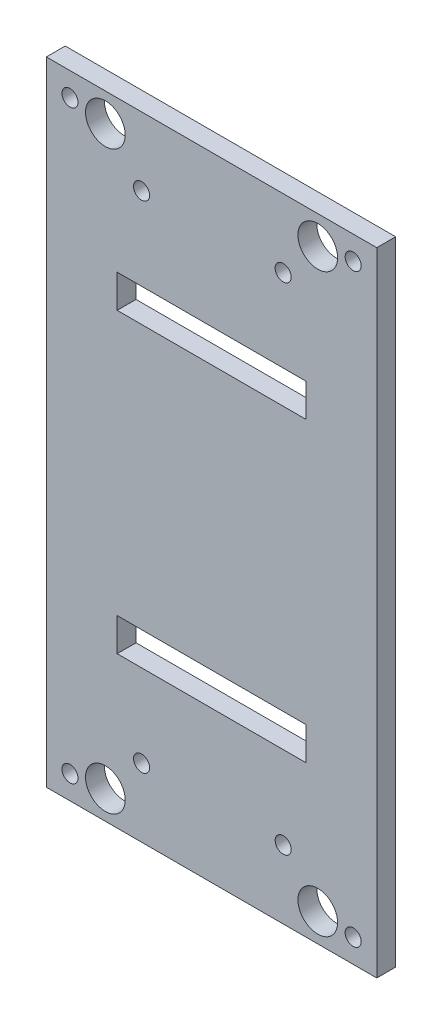
ISO-10303-21;
HEADER;
FILE_DESCRIPTION(('STEP AP214'),'2;1');
FILE_NAME('part.step','',(''),(''),'','','');
FILE_SCHEMA(('AUTOMOTIVE_DESIGN { 1 0 10303 214 1 1 1 1 }'));
ENDSEC;
DATA;
#1=APPLICATION_CONTEXT('core data for automotive mechanical design processes');
#2=APPLICATION_PROTOCOL_DEFINITION('international standard','automotive_design',2000,#1);
#3=PRODUCT_CONTEXT('',#1,'mechanical');
#4=PRODUCT('Part','Part','',(#3));
#5=PRODUCT_RELATED_PRODUCT_CATEGORY('part','',(#4));
#6=PRODUCT_DEFINITION_FORMATION('','',#4);
#7=PRODUCT_DEFINITION_CONTEXT('part definition',#1,'design');
#8=PRODUCT_DEFINITION('design','',#6,#7);
#9=PRODUCT_DEFINITION_SHAPE('','',#8);
#10=(LENGTH_UNIT() NAMED_UNIT(*) SI_UNIT(.MILLI.,.METRE.));
#11=(NAMED_UNIT(*) PLANE_ANGLE_UNIT() SI_UNIT($,.RADIAN.));
#12=(NAMED_UNIT(*) SI_UNIT($,.STERADIAN.) SOLID_ANGLE_UNIT());
#13=UNCERTAINTY_MEASURE_WITH_UNIT(LENGTH_MEASURE(1.E-05),#10,'distance_accuracy_value','');
#14=(GEOMETRIC_REPRESENTATION_CONTEXT(3) GLOBAL_UNCERTAINTY_ASSIGNED_CONTEXT((#13)) GLOBAL_UNIT_ASSIGNED_CONTEXT((#10,
#11,#12)) REPRESENTATION_CONTEXT('',''));
#15=CARTESIAN_POINT('',(0.,0.,0.));
#16=DIRECTION('',(0.,0.,1.));
#17=DIRECTION('',(1.,0.,0.));
#18=AXIS2_PLACEMENT_3D('',#15,#16,#17);
#19=CARTESIAN_POINT('',(-35.,-67.,61.));
#20=DIRECTION('',(1.,0.,0.));
#21=DIRECTION('',(0.,0.,-1.));
#22=AXIS2_PLACEMENT_3D('',#19,#20,#21);
#23=PLANE('',#22);
#24=DIRECTION('',(0.,-1.,0.));
#25=VECTOR('',#24,1.);
#26=CARTESIAN_POINT('',(-35.,-67.,57.));
#27=LINE('',#26,#25);
#28=CARTESIAN_POINT('',(-35.,67.,57.));
#29=VERTEX_POINT('',#28);
#30=CARTESIAN_POINT('',(-35.,-67.,57.));
#31=VERTEX_POINT('',#30);
#32=EDGE_CURVE('E268',#29,#31,#27,.T.);
#33=ORIENTED_EDGE('',*,*,#32,.T.);
#34=DIRECTION('',(0.,0.,-1.));
#35=VECTOR('',#34,1.);
#36=CARTESIAN_POINT('',(-35.,-67.,61.));
#37=LINE('',#36,#35);
#38=CARTESIAN_POINT('',(-35.,-67.,61.));
#39=VERTEX_POINT('',#38);
#40=EDGE_CURVE('E137',#39,#31,#37,.T.);
#41=ORIENTED_EDGE('',*,*,#40,.F.);
#42=DIRECTION('',(0.,-1.,0.));
#43=VECTOR('',#42,1.);
#44=CARTESIAN_POINT('',(-35.,-67.,61.));
#45=LINE('',#44,#43);
#46=CARTESIAN_POINT('',(-35.,67.,61.));
#47=VERTEX_POINT('',#46);
#48=EDGE_CURVE('E269',#47,#39,#45,.T.);
#49=ORIENTED_EDGE('',*,*,#48,.F.);
#50=DIRECTION('',(0.,0.,-1.));
#51=VECTOR('',#50,1.);
#52=CARTESIAN_POINT('',(-35.,67.,61.));
#53=LINE('',#52,#51);
#54=EDGE_CURVE('E279',#47,#29,#53,.T.);
#55=ORIENTED_EDGE('',*,*,#54,.T.);
#56=EDGE_LOOP('',(#33,#41,#49,#55));
#57=FACE_BOUND('',#56,.T.);
#58=ADVANCED_FACE('F41',(#57),#23,.F.);
#59=CARTESIAN_POINT('',(-35.,-67.,61.));
#60=DIRECTION('',(0.,1.,0.));
#61=DIRECTION('',(0.,0.,1.));
#62=AXIS2_PLACEMENT_3D('',#59,#60,#61);
#63=PLANE('',#62);
#64=DIRECTION('',(1.,0.,0.));
#65=VECTOR('',#64,1.);
#66=CARTESIAN_POINT('',(-35.,-67.,57.));
#67=LINE('',#66,#65);
#68=CARTESIAN_POINT('',(35.,-67.,57.));
#69=VERTEX_POINT('',#68);
#70=EDGE_CURVE('E282',#31,#69,#67,.T.);
#71=ORIENTED_EDGE('',*,*,#70,.T.);
#72=DIRECTION('',(0.,0.,-1.));
#73=VECTOR('',#72,1.);
#74=CARTESIAN_POINT('',(35.,-67.,61.));
#75=LINE('',#74,#73);
#76=CARTESIAN_POINT('',(35.,-67.,61.));
#77=VERTEX_POINT('',#76);
#78=EDGE_CURVE('E292',#77,#69,#75,.T.);
#79=ORIENTED_EDGE('',*,*,#78,.F.);
#80=DIRECTION('',(1.,0.,0.));
#81=VECTOR('',#80,1.);
#82=CARTESIAN_POINT('',(-35.,-67.,61.));
#83=LINE('',#82,#81);
#84=EDGE_CURVE('E272',#39,#77,#83,.T.);
#85=ORIENTED_EDGE('',*,*,#84,.F.);
#86=ORIENTED_EDGE('',*,*,#40,.T.);
#87=EDGE_LOOP('',(#71,#79,#85,#86));
#88=FACE_BOUND('',#87,.T.);
#89=ADVANCED_FACE('F320',(#88),#63,.F.);
#90=CARTESIAN_POINT('',(35.,-67.,61.));
#91=DIRECTION('',(-1.,0.,0.));
#92=DIRECTION('',(0.,0.,1.));
#93=AXIS2_PLACEMENT_3D('',#90,#91,#92);
#94=PLANE('',#93);
#95=DIRECTION('',(0.,1.,0.));
#96=VECTOR('',#95,1.);
#97=CARTESIAN_POINT('',(35.,-67.,57.));
#98=LINE('',#97,#96);
#99=CARTESIAN_POINT('',(35.,67.,57.));
#100=VERTEX_POINT('',#99);
#101=EDGE_CURVE('E284',#69,#100,#98,.T.);
#102=ORIENTED_EDGE('',*,*,#101,.T.);
#103=DIRECTION('',(0.,0.,-1.));
#104=VECTOR('',#103,1.);
#105=CARTESIAN_POINT('',(35.,67.,61.));
#106=LINE('',#105,#104);
#107=CARTESIAN_POINT('',(35.,67.,61.));
#108=VERTEX_POINT('',#107);
#109=EDGE_CURVE('E289',#108,#100,#106,.T.);
#110=ORIENTED_EDGE('',*,*,#109,.F.);
#111=DIRECTION('',(0.,1.,0.));
#112=VECTOR('',#111,1.);
#113=CARTESIAN_POINT('',(35.,-67.,61.));
#114=LINE('',#113,#112);
#115=EDGE_CURVE('E275',#77,#108,#114,.T.);
#116=ORIENTED_EDGE('',*,*,#115,.F.);
#117=ORIENTED_EDGE('',*,*,#78,.T.);
#118=EDGE_LOOP('',(#102,#110,#116,#117));
#119=FACE_BOUND('',#118,.T.);
#120=ADVANCED_FACE('F325',(#119),#94,.F.);
#121=CARTESIAN_POINT('',(-35.,67.,61.));
#122=DIRECTION('',(0.,-1.,0.));
#123=DIRECTION('',(0.,0.,-1.));
#124=AXIS2_PLACEMENT_3D('',#121,#122,#123);
#125=PLANE('',#124);
#126=DIRECTION('',(-1.,0.,0.));
#127=VECTOR('',#126,1.);
#128=CARTESIAN_POINT('',(-35.,67.,57.));
#129=LINE('',#128,#127);
#130=EDGE_CURVE('E273',#100,#29,#129,.T.);
#131=ORIENTED_EDGE('',*,*,#130,.T.);
#132=ORIENTED_EDGE('',*,*,#54,.F.);
#133=DIRECTION('',(-1.,0.,0.));
#134=VECTOR('',#133,1.);
#135=CARTESIAN_POINT('',(-35.,67.,61.));
#136=LINE('',#135,#134);
#137=EDGE_CURVE('E277',#108,#47,#136,.T.);
#138=ORIENTED_EDGE('',*,*,#137,.F.);
#139=ORIENTED_EDGE('',*,*,#109,.T.);
#140=EDGE_LOOP('',(#131,#132,#138,#139));
#141=FACE_BOUND('',#140,.T.);
#142=ADVANCED_FACE('F307',(#141),#125,.F.);
#143=CARTESIAN_POINT('',(0.,0.,61.));
#144=DIRECTION('',(0.,0.,-1.));
#145=DIRECTION('',(-1.,0.,0.));
#146=AXIS2_PLACEMENT_3D('',#143,#144,#145);
#147=PLANE('',#146);
#148=CARTESIAN_POINT('',(-22.5,61.,61.));
#149=DIRECTION('',(0.,0.,-1.));
#150=DIRECTION('',(-1.,0.,0.));
#151=AXIS2_PLACEMENT_3D('',#148,#149,#150);
#152=CIRCLE('',#151,4.2);
#153=CARTESIAN_POINT('',(-26.7,61.,61.));
#154=VERTEX_POINT('',#153);
#155=EDGE_CURVE('E212',#154,#154,#152,.T.);
#156=ORIENTED_EDGE('',*,*,#155,.T.);
#157=EDGE_LOOP('',(#156));
#158=FACE_BOUND('',#157,.T.);
#159=CARTESIAN_POINT('',(22.5,-61.,61.));
#160=DIRECTION('',(0.,0.,-1.));
#161=DIRECTION('',(-1.,0.,0.));
#162=AXIS2_PLACEMENT_3D('',#159,#160,#161);
#163=CIRCLE('',#162,4.2);
#164=CARTESIAN_POINT('',(18.3,-61.,61.));
#165=VERTEX_POINT('',#164);
#166=EDGE_CURVE('E201',#165,#165,#163,.T.);
#167=ORIENTED_EDGE('',*,*,#166,.T.);
#168=EDGE_LOOP('',(#167));
#169=FACE_BOUND('',#168,.T.);
#170=CARTESIAN_POINT('',(22.5,61.,61.));
#171=DIRECTION('',(0.,0.,-1.));
#172=DIRECTION('',(-1.,0.,0.));
#173=AXIS2_PLACEMENT_3D('',#170,#171,#172);
#174=CIRCLE('',#173,4.2);
#175=CARTESIAN_POINT('',(18.3,61.,61.));
#176=VERTEX_POINT('',#175);
#177=EDGE_CURVE('E198',#176,#176,#174,.T.);
#178=ORIENTED_EDGE('',*,*,#177,.T.);
#179=EDGE_LOOP('',(#178));
#180=FACE_BOUND('',#179,.T.);
#181=CARTESIAN_POINT('',(-22.5,-61.,61.));
#182=DIRECTION('',(0.,0.,-1.));
#183=DIRECTION('',(-1.,0.,0.));
#184=AXIS2_PLACEMENT_3D('',#181,#182,#183);
#185=CIRCLE('',#184,4.2);
#186=CARTESIAN_POINT('',(-26.7,-61.,61.));
#187=VERTEX_POINT('',#186);
#188=EDGE_CURVE('E195',#187,#187,#185,.T.);
#189=ORIENTED_EDGE('',*,*,#188,.T.);
#190=EDGE_LOOP('',(#189));
#191=FACE_BOUND('',#190,.T.);
#192=CARTESIAN_POINT('',(15.1722816789,52.5,61.));
#193=DIRECTION('',(0.,0.,-1.));
#194=DIRECTION('',(-1.,0.,0.));
#195=AXIS2_PLACEMENT_3D('',#192,#193,#194);
#196=CIRCLE('',#195,1.7);
#197=CARTESIAN_POINT('',(13.4722816789,52.5,61.));
#198=VERTEX_POINT('',#197);
#199=EDGE_CURVE('E191',#198,#198,#196,.T.);
#200=ORIENTED_EDGE('',*,*,#199,.T.);
#201=EDGE_LOOP('',(#200));
#202=FACE_BOUND('',#201,.T.);
#203=CARTESIAN_POINT('',(-14.8277183211,-52.5,61.));
#204=DIRECTION('',(0.,0.,-1.));
#205=DIRECTION('',(-1.,0.,0.));
#206=AXIS2_PLACEMENT_3D('',#203,#204,#205);
#207=CIRCLE('',#206,1.7);
#208=CARTESIAN_POINT('',(-16.5277183211,-52.5,61.));
#209=VERTEX_POINT('',#208);
#210=EDGE_CURVE('E187',#209,#209,#207,.T.);
#211=ORIENTED_EDGE('',*,*,#210,.T.);
#212=EDGE_LOOP('',(#211));
#213=FACE_BOUND('',#212,.T.);
#214=CARTESIAN_POINT('',(-14.8277183211,52.5,61.));
#215=DIRECTION('',(0.,0.,-1.));
#216=DIRECTION('',(-1.,0.,0.));
#217=AXIS2_PLACEMENT_3D('',#214,#215,#216);
#218=CIRCLE('',#217,1.7);
#219=CARTESIAN_POINT('',(-16.5277183211,52.5,61.));
#220=VERTEX_POINT('',#219);
#221=EDGE_CURVE('E182',#220,#220,#218,.T.);
#222=ORIENTED_EDGE('',*,*,#221,.T.);
#223=EDGE_LOOP('',(#222));
#224=FACE_BOUND('',#223,.T.);
#225=DIRECTION('',(-1.,0.,0.));
#226=VECTOR('',#225,1.);
#227=CARTESIAN_POINT('',(0.,-35.,61.));
#228=LINE('',#227,#226);
#229=CARTESIAN_POINT('',(20.,-35.,61.));
#230=VERTEX_POINT('',#229);
#231=CARTESIAN_POINT('',(-20.,-35.,61.));
#232=VERTEX_POINT('',#231);
#233=EDGE_CURVE('E251',#230,#232,#228,.T.);
#234=ORIENTED_EDGE('',*,*,#233,.T.);
#235=DIRECTION('',(0.,1.,0.));
#236=VECTOR('',#235,1.);
#237=CARTESIAN_POINT('',(-20.,0.,61.));
#238=LINE('',#237,#236);
#239=CARTESIAN_POINT('',(-20.,-28.,61.));
#240=VERTEX_POINT('',#239);
#241=EDGE_CURVE('E183',#232,#240,#238,.T.);
#242=ORIENTED_EDGE('',*,*,#241,.T.);
#243=DIRECTION('',(1.,0.,0.));
#244=VECTOR('',#243,1.);
#245=CARTESIAN_POINT('',(0.,-28.,61.));
#246=LINE('',#245,#244);
#247=CARTESIAN_POINT('',(20.,-28.,61.));
#248=VERTEX_POINT('',#247);
#249=EDGE_CURVE('E257',#240,#248,#246,.T.);
#250=ORIENTED_EDGE('',*,*,#249,.T.);
#251=DIRECTION('',(0.,-1.,0.));
#252=VECTOR('',#251,1.);
#253=CARTESIAN_POINT('',(20.,0.,61.));
#254=LINE('',#253,#252);
#255=EDGE_CURVE('E254',#248,#230,#254,.T.);
#256=ORIENTED_EDGE('',*,*,#255,.T.);
#257=EDGE_LOOP('',(#234,#242,#250,#256));
#258=FACE_BOUND('',#257,.T.);
#259=CARTESIAN_POINT('',(-30.,62.,61.));
#260=DIRECTION('',(0.,0.,-1.));
#261=DIRECTION('',(-1.,0.,0.));
#262=AXIS2_PLACEMENT_3D('',#259,#260,#261);
#263=CIRCLE('',#262,1.7);
#264=CARTESIAN_POINT('',(-31.7,62.,61.));
#265=VERTEX_POINT('',#264);
#266=EDGE_CURVE('E174',#265,#265,#263,.T.);
#267=ORIENTED_EDGE('',*,*,#266,.T.);
#268=EDGE_LOOP('',(#267));
#269=FACE_BOUND('',#268,.T.);
#270=CARTESIAN_POINT('',(30.,-62.,61.));
#271=DIRECTION('',(0.,0.,-1.));
#272=DIRECTION('',(-1.,0.,0.));
#273=AXIS2_PLACEMENT_3D('',#270,#271,#272);
#274=CIRCLE('',#273,1.7);
#275=CARTESIAN_POINT('',(28.3,-62.,61.));
#276=VERTEX_POINT('',#275);
#277=EDGE_CURVE('E171',#276,#276,#274,.T.);
#278=ORIENTED_EDGE('',*,*,#277,.T.);
#279=EDGE_LOOP('',(#278));
#280=FACE_BOUND('',#279,.T.);
#281=CARTESIAN_POINT('',(30.,62.,61.));
#282=DIRECTION('',(0.,0.,-1.));
#283=DIRECTION('',(-1.,0.,0.));
#284=AXIS2_PLACEMENT_3D('',#281,#282,#283);
#285=CIRCLE('',#284,1.7);
#286=CARTESIAN_POINT('',(28.3,62.,61.));
#287=VERTEX_POINT('',#286);
#288=EDGE_CURVE('E167',#287,#287,#285,.T.);
#289=ORIENTED_EDGE('',*,*,#288,.T.);
#290=EDGE_LOOP('',(#289));
#291=FACE_BOUND('',#290,.T.);
#292=CARTESIAN_POINT('',(15.1722816789,-52.5,61.));
#293=DIRECTION('',(0.,0.,-1.));
#294=DIRECTION('',(-1.,0.,0.));
#295=AXIS2_PLACEMENT_3D('',#292,#293,#294);
#296=CIRCLE('',#295,1.7);
#297=CARTESIAN_POINT('',(13.4722816789,-52.5,61.));
#298=VERTEX_POINT('',#297);
#299=EDGE_CURVE('E163',#298,#298,#296,.T.);
#300=ORIENTED_EDGE('',*,*,#299,.T.);
#301=EDGE_LOOP('',(#300));
#302=FACE_BOUND('',#301,.T.);
#303=DIRECTION('',(-1.,0.,0.));
#304=VECTOR('',#303,1.);
#305=CARTESIAN_POINT('',(0.,28.,61.));
#306=LINE('',#305,#304);
#307=CARTESIAN_POINT('',(20.,28.,61.));
#308=VERTEX_POINT('',#307);
#309=CARTESIAN_POINT('',(-20.,28.,61.));
#310=VERTEX_POINT('',#309);
#311=EDGE_CURVE('E234',#308,#310,#306,.T.);
#312=ORIENTED_EDGE('',*,*,#311,.T.);
#313=DIRECTION('',(0.,1.,0.));
#314=VECTOR('',#313,1.);
#315=CARTESIAN_POINT('',(-20.,0.,61.));
#316=LINE('',#315,#314);
#317=CARTESIAN_POINT('',(-20.,35.,61.));
#318=VERTEX_POINT('',#317);
#319=EDGE_CURVE('E145',#310,#318,#316,.T.);
#320=ORIENTED_EDGE('',*,*,#319,.T.);
#321=DIRECTION('',(1.,0.,0.));
#322=VECTOR('',#321,1.);
#323=CARTESIAN_POINT('',(0.,35.,61.));
#324=LINE('',#323,#322);
#325=CARTESIAN_POINT('',(20.,35.,61.));
#326=VERTEX_POINT('',#325);
#327=EDGE_CURVE('E239',#318,#326,#324,.T.);
#328=ORIENTED_EDGE('',*,*,#327,.T.);
#329=DIRECTION('',(0.,-1.,0.));
#330=VECTOR('',#329,1.);
#331=CARTESIAN_POINT('',(20.,0.,61.));
#332=LINE('',#331,#330);
#333=EDGE_CURVE('E236',#326,#308,#332,.T.);
#334=ORIENTED_EDGE('',*,*,#333,.T.);
#335=EDGE_LOOP('',(#312,#320,#328,#334));
#336=FACE_BOUND('',#335,.T.);
#337=CARTESIAN_POINT('',(-30.,-62.,61.));
#338=DIRECTION('',(0.,0.,-1.));
#339=DIRECTION('',(-1.,0.,0.));
#340=AXIS2_PLACEMENT_3D('',#337,#338,#339);
#341=CIRCLE('',#340,1.7);
#342=CARTESIAN_POINT('',(-31.7,-62.,61.));
#343=VERTEX_POINT('',#342);
#344=EDGE_CURVE('E231',#343,#343,#341,.T.);
#345=ORIENTED_EDGE('',*,*,#344,.T.);
#346=EDGE_LOOP('',(#345));
#347=FACE_BOUND('',#346,.T.);
#348=ORIENTED_EDGE('',*,*,#48,.T.);
#349=ORIENTED_EDGE('',*,*,#84,.T.);
#350=ORIENTED_EDGE('',*,*,#115,.T.);
#351=ORIENTED_EDGE('',*,*,#137,.T.);
#352=EDGE_LOOP('',(#348,#349,#350,#351));
#353=FACE_BOUND('',#352,.T.);
#354=ADVANCED_FACE('F304',(#158,#169,#180,#191,#202,#213,#224,#258,#269,#280,#291,#302,#336,
#347,#353),#147,.F.);
#355=CARTESIAN_POINT('',(0.,0.,57.));
#356=DIRECTION('',(0.,0.,-1.));
#357=DIRECTION('',(-1.,0.,0.));
#358=AXIS2_PLACEMENT_3D('',#355,#356,#357);
#359=PLANE('',#358);
#360=CARTESIAN_POINT('',(-22.5,61.,57.));
#361=DIRECTION('',(0.,0.,-1.));
#362=DIRECTION('',(-1.,0.,0.));
#363=AXIS2_PLACEMENT_3D('',#360,#361,#362);
#364=CIRCLE('',#363,4.2);
#365=CARTESIAN_POINT('',(-26.7,61.,57.));
#366=VERTEX_POINT('',#365);
#367=EDGE_CURVE('E44',#366,#366,#364,.T.);
#368=ORIENTED_EDGE('',*,*,#367,.F.);
#369=EDGE_LOOP('',(#368));
#370=FACE_BOUND('',#369,.T.);
#371=CARTESIAN_POINT('',(22.5,-61.,57.));
#372=DIRECTION('',(0.,0.,-1.));
#373=DIRECTION('',(-1.,0.,0.));
#374=AXIS2_PLACEMENT_3D('',#371,#372,#373);
#375=CIRCLE('',#374,4.2);
#376=CARTESIAN_POINT('',(18.3,-61.,57.));
#377=VERTEX_POINT('',#376);
#378=EDGE_CURVE('E199',#377,#377,#375,.T.);
#379=ORIENTED_EDGE('',*,*,#378,.F.);
#380=EDGE_LOOP('',(#379));
#381=FACE_BOUND('',#380,.T.);
#382=CARTESIAN_POINT('',(22.5,61.,57.));
#383=DIRECTION('',(0.,0.,-1.));
#384=DIRECTION('',(-1.,0.,0.));
#385=AXIS2_PLACEMENT_3D('',#382,#383,#384);
#386=CIRCLE('',#385,4.2);
#387=CARTESIAN_POINT('',(18.3,61.,57.));
#388=VERTEX_POINT('',#387);
#389=EDGE_CURVE('E196',#388,#388,#386,.T.);
#390=ORIENTED_EDGE('',*,*,#389,.F.);
#391=EDGE_LOOP('',(#390));
#392=FACE_BOUND('',#391,.T.);
#393=CARTESIAN_POINT('',(-22.5,-61.,57.));
#394=DIRECTION('',(0.,0.,-1.));
#395=DIRECTION('',(-1.,0.,0.));
#396=AXIS2_PLACEMENT_3D('',#393,#394,#395);
#397=CIRCLE('',#396,4.2);
#398=CARTESIAN_POINT('',(-26.7,-61.,57.));
#399=VERTEX_POINT('',#398);
#400=EDGE_CURVE('E192',#399,#399,#397,.T.);
#401=ORIENTED_EDGE('',*,*,#400,.F.);
#402=EDGE_LOOP('',(#401));
#403=FACE_BOUND('',#402,.T.);
#404=CARTESIAN_POINT('',(15.1722816789,52.5,57.));
#405=DIRECTION('',(0.,0.,-1.));
#406=DIRECTION('',(-1.,0.,0.));
#407=AXIS2_PLACEMENT_3D('',#404,#405,#406);
#408=CIRCLE('',#407,1.7);
#409=CARTESIAN_POINT('',(13.4722816789,52.5,57.));
#410=VERTEX_POINT('',#409);
#411=EDGE_CURVE('E188',#410,#410,#408,.T.);
#412=ORIENTED_EDGE('',*,*,#411,.F.);
#413=EDGE_LOOP('',(#412));
#414=FACE_BOUND('',#413,.T.);
#415=CARTESIAN_POINT('',(-14.8277183211,-52.5,57.));
#416=DIRECTION('',(0.,0.,-1.));
#417=DIRECTION('',(-1.,0.,0.));
#418=AXIS2_PLACEMENT_3D('',#415,#416,#417);
#419=CIRCLE('',#418,1.7);
#420=CARTESIAN_POINT('',(-16.5277183211,-52.5,57.));
#421=VERTEX_POINT('',#420);
#422=EDGE_CURVE('E184',#421,#421,#419,.T.);
#423=ORIENTED_EDGE('',*,*,#422,.F.);
#424=EDGE_LOOP('',(#423));
#425=FACE_BOUND('',#424,.T.);
#426=CARTESIAN_POINT('',(-14.8277183211,52.5,57.));
#427=DIRECTION('',(0.,0.,-1.));
#428=DIRECTION('',(-1.,0.,0.));
#429=AXIS2_PLACEMENT_3D('',#426,#427,#428);
#430=CIRCLE('',#429,1.7);
#431=CARTESIAN_POINT('',(-16.5277183211,52.5,57.));
#432=VERTEX_POINT('',#431);
#433=EDGE_CURVE('E179',#432,#432,#430,.T.);
#434=ORIENTED_EDGE('',*,*,#433,.F.);
#435=EDGE_LOOP('',(#434));
#436=FACE_BOUND('',#435,.T.);
#437=DIRECTION('',(0.,1.,0.));
#438=VECTOR('',#437,1.);
#439=CARTESIAN_POINT('',(-20.,0.,57.));
#440=LINE('',#439,#438);
#441=CARTESIAN_POINT('',(-20.,-35.,57.));
#442=VERTEX_POINT('',#441);
#443=CARTESIAN_POINT('',(-20.,-28.,57.));
#444=VERTEX_POINT('',#443);
#445=EDGE_CURVE('E11',#442,#444,#440,.T.);
#446=ORIENTED_EDGE('',*,*,#445,.F.);
#447=DIRECTION('',(-1.,0.,0.));
#448=VECTOR('',#447,1.);
#449=CARTESIAN_POINT('',(0.,-35.,57.));
#450=LINE('',#449,#448);
#451=CARTESIAN_POINT('',(20.,-35.,57.));
#452=VERTEX_POINT('',#451);
#453=EDGE_CURVE('E153',#452,#442,#450,.T.);
#454=ORIENTED_EDGE('',*,*,#453,.F.);
#455=DIRECTION('',(0.,-1.,0.));
#456=VECTOR('',#455,1.);
#457=CARTESIAN_POINT('',(20.,0.,57.));
#458=LINE('',#457,#456);
#459=CARTESIAN_POINT('',(20.,-28.,57.));
#460=VERTEX_POINT('',#459);
#461=EDGE_CURVE('E155',#460,#452,#458,.T.);
#462=ORIENTED_EDGE('',*,*,#461,.F.);
#463=DIRECTION('',(1.,0.,0.));
#464=VECTOR('',#463,1.);
#465=CARTESIAN_POINT('',(0.,-28.,57.));
#466=LINE('',#465,#464);
#467=EDGE_CURVE('E49',#444,#460,#466,.T.);
#468=ORIENTED_EDGE('',*,*,#467,.F.);
#469=EDGE_LOOP('',(#446,#454,#462,#468));
#470=FACE_BOUND('',#469,.T.);
#471=CARTESIAN_POINT('',(-30.,62.,57.));
#472=DIRECTION('',(0.,0.,-1.));
#473=DIRECTION('',(-1.,0.,0.));
#474=AXIS2_PLACEMENT_3D('',#471,#472,#473);
#475=CIRCLE('',#474,1.7);
#476=CARTESIAN_POINT('',(-31.7,62.,57.));
#477=VERTEX_POINT('',#476);
#478=EDGE_CURVE('E172',#477,#477,#475,.T.);
#479=ORIENTED_EDGE('',*,*,#478,.F.);
#480=EDGE_LOOP('',(#479));
#481=FACE_BOUND('',#480,.T.);
#482=CARTESIAN_POINT('',(30.,-62.,57.));
#483=DIRECTION('',(0.,0.,-1.));
#484=DIRECTION('',(-1.,0.,0.));
#485=AXIS2_PLACEMENT_3D('',#482,#483,#484);
#486=CIRCLE('',#485,1.7);
#487=CARTESIAN_POINT('',(28.3,-62.,57.));
#488=VERTEX_POINT('',#487);
#489=EDGE_CURVE('E168',#488,#488,#486,.T.);
#490=ORIENTED_EDGE('',*,*,#489,.F.);
#491=EDGE_LOOP('',(#490));
#492=FACE_BOUND('',#491,.T.);
#493=CARTESIAN_POINT('',(30.,62.,57.));
#494=DIRECTION('',(0.,0.,-1.));
#495=DIRECTION('',(-1.,0.,0.));
#496=AXIS2_PLACEMENT_3D('',#493,#494,#495);
#497=CIRCLE('',#496,1.7);
#498=CARTESIAN_POINT('',(28.3,62.,57.));
#499=VERTEX_POINT('',#498);
#500=EDGE_CURVE('E164',#499,#499,#497,.T.);
#501=ORIENTED_EDGE('',*,*,#500,.F.);
#502=EDGE_LOOP('',(#501));
#503=FACE_BOUND('',#502,.T.);
#504=CARTESIAN_POINT('',(15.1722816789,-52.5,57.));
#505=DIRECTION('',(0.,0.,-1.));
#506=DIRECTION('',(-1.,0.,0.));
#507=AXIS2_PLACEMENT_3D('',#504,#505,#506);
#508=CIRCLE('',#507,1.7);
#509=CARTESIAN_POINT('',(13.4722816789,-52.5,57.));
#510=VERTEX_POINT('',#509);
#511=EDGE_CURVE('E160',#510,#510,#508,.T.);
#512=ORIENTED_EDGE('',*,*,#511,.F.);
#513=EDGE_LOOP('',(#512));
#514=FACE_BOUND('',#513,.T.);
#515=DIRECTION('',(0.,1.,0.));
#516=VECTOR('',#515,1.);
#517=CARTESIAN_POINT('',(-20.,0.,57.));
#518=LINE('',#517,#516);
#519=CARTESIAN_POINT('',(-20.,28.,57.));
#520=VERTEX_POINT('',#519);
#521=CARTESIAN_POINT('',(-20.,35.,57.));
#522=VERTEX_POINT('',#521);
#523=EDGE_CURVE('E142',#520,#522,#518,.T.);
#524=ORIENTED_EDGE('',*,*,#523,.F.);
#525=DIRECTION('',(-1.,0.,0.));
#526=VECTOR('',#525,1.);
#527=CARTESIAN_POINT('',(0.,28.,57.));
#528=LINE('',#527,#526);
#529=CARTESIAN_POINT('',(20.,28.,57.));
#530=VERTEX_POINT('',#529);
#531=EDGE_CURVE('E128',#530,#520,#528,.T.);
#532=ORIENTED_EDGE('',*,*,#531,.F.);
#533=DIRECTION('',(0.,-1.,0.));
#534=VECTOR('',#533,1.);
#535=CARTESIAN_POINT('',(20.,0.,57.));
#536=LINE('',#535,#534);
#537=CARTESIAN_POINT('',(20.,35.,57.));
#538=VERTEX_POINT('',#537);
#539=EDGE_CURVE('E136',#538,#530,#536,.T.);
#540=ORIENTED_EDGE('',*,*,#539,.F.);
#541=DIRECTION('',(1.,0.,0.));
#542=VECTOR('',#541,1.);
#543=CARTESIAN_POINT('',(0.,35.,57.));
#544=LINE('',#543,#542);
#545=EDGE_CURVE('E152',#522,#538,#544,.T.);
#546=ORIENTED_EDGE('',*,*,#545,.F.);
#547=EDGE_LOOP('',(#524,#532,#540,#546));
#548=FACE_BOUND('',#547,.T.);
#549=CARTESIAN_POINT('',(-30.,-62.,57.));
#550=DIRECTION('',(0.,0.,-1.));
#551=DIRECTION('',(-1.,0.,0.));
#552=AXIS2_PLACEMENT_3D('',#549,#550,#551);
#553=CIRCLE('',#552,1.7);
#554=CARTESIAN_POINT('',(-31.7,-62.,57.));
#555=VERTEX_POINT('',#554);
#556=EDGE_CURVE('E222',#555,#555,#553,.T.);
#557=ORIENTED_EDGE('',*,*,#556,.F.);
#558=EDGE_LOOP('',(#557));
#559=FACE_BOUND('',#558,.T.);
#560=ORIENTED_EDGE('',*,*,#32,.F.);
#561=ORIENTED_EDGE('',*,*,#130,.F.);
#562=ORIENTED_EDGE('',*,*,#101,.F.);
#563=ORIENTED_EDGE('',*,*,#70,.F.);
#564=EDGE_LOOP('',(#560,#561,#562,#563));
#565=FACE_BOUND('',#564,.T.);
#566=ADVANCED_FACE('F150',(#370,#381,#392,#403,#414,#425,#436,#470,#481,#492,#503,#514,#548,
#559,#565),#359,.T.);
#567=CARTESIAN_POINT('',(-30.,-62.,56.));
#568=DIRECTION('',(0.,0.,1.));
#569=DIRECTION('',(1.,0.,0.));
#570=AXIS2_PLACEMENT_3D('',#567,#568,#569);
#571=CYLINDRICAL_SURFACE('',#570,1.7);
#572=ORIENTED_EDGE('',*,*,#556,.T.);
#573=EDGE_LOOP('',(#572));
#574=FACE_BOUND('',#573,.T.);
#575=ORIENTED_EDGE('',*,*,#344,.F.);
#576=EDGE_LOOP('',(#575));
#577=FACE_BOUND('',#576,.T.);
#578=ADVANCED_FACE('F330',(#574,#577),#571,.F.);
#579=CARTESIAN_POINT('',(-20.,28.,56.));
#580=DIRECTION('',(-1.,0.,0.));
#581=DIRECTION('',(0.,0.,1.));
#582=AXIS2_PLACEMENT_3D('',#579,#580,#581);
#583=PLANE('',#582);
#584=DIRECTION('',(0.,0.,1.));
#585=VECTOR('',#584,1.);
#586=CARTESIAN_POINT('',(-20.,28.,56.));
#587=LINE('',#586,#585);
#588=EDGE_CURVE('E65',#520,#310,#587,.T.);
#589=ORIENTED_EDGE('',*,*,#588,.F.);
#590=ORIENTED_EDGE('',*,*,#523,.T.);
#591=DIRECTION('',(0.,0.,1.));
#592=VECTOR('',#591,1.);
#593=CARTESIAN_POINT('',(-20.,35.,56.));
#594=LINE('',#593,#592);
#595=EDGE_CURVE('E214',#522,#318,#594,.T.);
#596=ORIENTED_EDGE('',*,*,#595,.T.);
#597=ORIENTED_EDGE('',*,*,#319,.F.);
#598=EDGE_LOOP('',(#589,#590,#596,#597));
#599=FACE_BOUND('',#598,.T.);
#600=ADVANCED_FACE('F140',(#599),#583,.F.);
#601=CARTESIAN_POINT('',(-20.,35.,56.));
#602=DIRECTION('',(0.,1.,0.));
#603=DIRECTION('',(0.,0.,1.));
#604=AXIS2_PLACEMENT_3D('',#601,#602,#603);
#605=PLANE('',#604);
#606=ORIENTED_EDGE('',*,*,#595,.F.);
#607=ORIENTED_EDGE('',*,*,#545,.T.);
#608=DIRECTION('',(0.,0.,1.));
#609=VECTOR('',#608,1.);
#610=CARTESIAN_POINT('',(20.,35.,56.));
#611=LINE('',#610,#609);
#612=EDGE_CURVE('E217',#538,#326,#611,.T.);
#613=ORIENTED_EDGE('',*,*,#612,.T.);
#614=ORIENTED_EDGE('',*,*,#327,.F.);
#615=EDGE_LOOP('',(#606,#607,#613,#614));
#616=FACE_BOUND('',#615,.T.);
#617=ADVANCED_FACE('F302',(#616),#605,.F.);
#618=CARTESIAN_POINT('',(20.,28.,56.));
#619=DIRECTION('',(1.,0.,0.));
#620=DIRECTION('',(0.,0.,-1.));
#621=AXIS2_PLACEMENT_3D('',#618,#619,#620);
#622=PLANE('',#621);
#623=ORIENTED_EDGE('',*,*,#612,.F.);
#624=ORIENTED_EDGE('',*,*,#539,.T.);
#625=DIRECTION('',(0.,0.,1.));
#626=VECTOR('',#625,1.);
#627=CARTESIAN_POINT('',(20.,28.,56.));
#628=LINE('',#627,#626);
#629=EDGE_CURVE('E131',#530,#308,#628,.T.);
#630=ORIENTED_EDGE('',*,*,#629,.T.);
#631=ORIENTED_EDGE('',*,*,#333,.F.);
#632=EDGE_LOOP('',(#623,#624,#630,#631));
#633=FACE_BOUND('',#632,.T.);
#634=ADVANCED_FACE('F300',(#633),#622,.F.);
#635=CARTESIAN_POINT('',(-20.,28.,56.));
#636=DIRECTION('',(0.,-1.,0.));
#637=DIRECTION('',(0.,0.,-1.));
#638=AXIS2_PLACEMENT_3D('',#635,#636,#637);
#639=PLANE('',#638);
#640=ORIENTED_EDGE('',*,*,#629,.F.);
#641=ORIENTED_EDGE('',*,*,#531,.T.);
#642=ORIENTED_EDGE('',*,*,#588,.T.);
#643=ORIENTED_EDGE('',*,*,#311,.F.);
#644=EDGE_LOOP('',(#640,#641,#642,#643));
#645=FACE_BOUND('',#644,.T.);
#646=ADVANCED_FACE('F129',(#645),#639,.F.);
#647=CARTESIAN_POINT('',(15.1722816789,-52.5,56.));
#648=DIRECTION('',(0.,0.,1.));
#649=DIRECTION('',(1.,0.,0.));
#650=AXIS2_PLACEMENT_3D('',#647,#648,#649);
#651=CYLINDRICAL_SURFACE('',#650,1.7);
#652=ORIENTED_EDGE('',*,*,#511,.T.);
#653=EDGE_LOOP('',(#652));
#654=FACE_BOUND('',#653,.T.);
#655=ORIENTED_EDGE('',*,*,#299,.F.);
#656=EDGE_LOOP('',(#655));
#657=FACE_BOUND('',#656,.T.);
#658=ADVANCED_FACE('F389',(#654,#657),#651,.F.);
#659=CARTESIAN_POINT('',(30.,62.,56.));
#660=DIRECTION('',(0.,0.,1.));
#661=DIRECTION('',(1.,0.,0.));
#662=AXIS2_PLACEMENT_3D('',#659,#660,#661);
#663=CYLINDRICAL_SURFACE('',#662,1.7);
#664=ORIENTED_EDGE('',*,*,#500,.T.);
#665=EDGE_LOOP('',(#664));
#666=FACE_BOUND('',#665,.T.);
#667=ORIENTED_EDGE('',*,*,#288,.F.);
#668=EDGE_LOOP('',(#667));
#669=FACE_BOUND('',#668,.T.);
#670=ADVANCED_FACE('F397',(#666,#669),#663,.F.);
#671=CARTESIAN_POINT('',(30.,-62.,56.));
#672=DIRECTION('',(0.,0.,1.));
#673=DIRECTION('',(1.,0.,0.));
#674=AXIS2_PLACEMENT_3D('',#671,#672,#673);
#675=CYLINDRICAL_SURFACE('',#674,1.7);
#676=ORIENTED_EDGE('',*,*,#489,.T.);
#677=EDGE_LOOP('',(#676));
#678=FACE_BOUND('',#677,.T.);
#679=ORIENTED_EDGE('',*,*,#277,.F.);
#680=EDGE_LOOP('',(#679));
#681=FACE_BOUND('',#680,.T.);
#682=ADVANCED_FACE('F406',(#678,#681),#675,.F.);
#683=CARTESIAN_POINT('',(-30.,62.,56.));
#684=DIRECTION('',(0.,0.,1.));
#685=DIRECTION('',(1.,0.,0.));
#686=AXIS2_PLACEMENT_3D('',#683,#684,#685);
#687=CYLINDRICAL_SURFACE('',#686,1.7);
#688=ORIENTED_EDGE('',*,*,#478,.T.);
#689=EDGE_LOOP('',(#688));
#690=FACE_BOUND('',#689,.T.);
#691=ORIENTED_EDGE('',*,*,#266,.F.);
#692=EDGE_LOOP('',(#691));
#693=FACE_BOUND('',#692,.T.);
#694=ADVANCED_FACE('F415',(#690,#693),#687,.F.);
#695=CARTESIAN_POINT('',(-20.,-35.,56.));
#696=DIRECTION('',(-1.,0.,0.));
#697=DIRECTION('',(0.,0.,1.));
#698=AXIS2_PLACEMENT_3D('',#695,#696,#697);
#699=PLANE('',#698);
#700=DIRECTION('',(0.,0.,1.));
#701=VECTOR('',#700,1.);
#702=CARTESIAN_POINT('',(-20.,-35.,56.));
#703=LINE('',#702,#701);
#704=EDGE_CURVE('E57',#442,#232,#703,.T.);
#705=ORIENTED_EDGE('',*,*,#704,.F.);
#706=ORIENTED_EDGE('',*,*,#445,.T.);
#707=DIRECTION('',(0.,0.,1.));
#708=VECTOR('',#707,1.);
#709=CARTESIAN_POINT('',(-20.,-28.,56.));
#710=LINE('',#709,#708);
#711=EDGE_CURVE('E147',#444,#240,#710,.T.);
#712=ORIENTED_EDGE('',*,*,#711,.T.);
#713=ORIENTED_EDGE('',*,*,#241,.F.);
#714=EDGE_LOOP('',(#705,#706,#712,#713));
#715=FACE_BOUND('',#714,.T.);
#716=ADVANCED_FACE('F424',(#715),#699,.F.);
#717=CARTESIAN_POINT('',(-20.,-28.,56.));
#718=DIRECTION('',(0.,1.,0.));
#719=DIRECTION('',(0.,0.,1.));
#720=AXIS2_PLACEMENT_3D('',#717,#718,#719);
#721=PLANE('',#720);
#722=ORIENTED_EDGE('',*,*,#711,.F.);
#723=ORIENTED_EDGE('',*,*,#467,.T.);
#724=DIRECTION('',(0.,0.,1.));
#725=VECTOR('',#724,1.);
#726=CARTESIAN_POINT('',(20.,-28.,56.));
#727=LINE('',#726,#725);
#728=EDGE_CURVE('E226',#460,#248,#727,.T.);
#729=ORIENTED_EDGE('',*,*,#728,.T.);
#730=ORIENTED_EDGE('',*,*,#249,.F.);
#731=EDGE_LOOP('',(#722,#723,#729,#730));
#732=FACE_BOUND('',#731,.T.);
#733=ADVANCED_FACE('F433',(#732),#721,.F.);
#734=CARTESIAN_POINT('',(20.,-35.,56.));
#735=DIRECTION('',(1.,0.,0.));
#736=DIRECTION('',(0.,0.,-1.));
#737=AXIS2_PLACEMENT_3D('',#734,#735,#736);
#738=PLANE('',#737);
#739=ORIENTED_EDGE('',*,*,#728,.F.);
#740=ORIENTED_EDGE('',*,*,#461,.T.);
#741=DIRECTION('',(0.,0.,1.));
#742=VECTOR('',#741,1.);
#743=CARTESIAN_POINT('',(20.,-35.,56.));
#744=LINE('',#743,#742);
#745=EDGE_CURVE('E223',#452,#230,#744,.T.);
#746=ORIENTED_EDGE('',*,*,#745,.T.);
#747=ORIENTED_EDGE('',*,*,#255,.F.);
#748=EDGE_LOOP('',(#739,#740,#746,#747));
#749=FACE_BOUND('',#748,.T.);
#750=ADVANCED_FACE('F442',(#749),#738,.F.);
#751=CARTESIAN_POINT('',(-20.,-35.,56.));
#752=DIRECTION('',(0.,-1.,0.));
#753=DIRECTION('',(0.,0.,-1.));
#754=AXIS2_PLACEMENT_3D('',#751,#752,#753);
#755=PLANE('',#754);
#756=ORIENTED_EDGE('',*,*,#745,.F.);
#757=ORIENTED_EDGE('',*,*,#453,.T.);
#758=ORIENTED_EDGE('',*,*,#704,.T.);
#759=ORIENTED_EDGE('',*,*,#233,.F.);
#760=EDGE_LOOP('',(#756,#757,#758,#759));
#761=FACE_BOUND('',#760,.T.);
#762=ADVANCED_FACE('F451',(#761),#755,.F.);
#763=CARTESIAN_POINT('',(-14.8277183211,52.5,56.));
#764=DIRECTION('',(0.,0.,1.));
#765=DIRECTION('',(1.,0.,0.));
#766=AXIS2_PLACEMENT_3D('',#763,#764,#765);
#767=CYLINDRICAL_SURFACE('',#766,1.7);
#768=ORIENTED_EDGE('',*,*,#433,.T.);
#769=EDGE_LOOP('',(#768));
#770=FACE_BOUND('',#769,.T.);
#771=ORIENTED_EDGE('',*,*,#221,.F.);
#772=EDGE_LOOP('',(#771));
#773=FACE_BOUND('',#772,.T.);
#774=ADVANCED_FACE('F460',(#770,#773),#767,.F.);
#775=CARTESIAN_POINT('',(-14.8277183211,-52.5,56.));
#776=DIRECTION('',(0.,0.,1.));
#777=DIRECTION('',(1.,0.,0.));
#778=AXIS2_PLACEMENT_3D('',#775,#776,#777);
#779=CYLINDRICAL_SURFACE('',#778,1.7);
#780=ORIENTED_EDGE('',*,*,#422,.T.);
#781=EDGE_LOOP('',(#780));
#782=FACE_BOUND('',#781,.T.);
#783=ORIENTED_EDGE('',*,*,#210,.F.);
#784=EDGE_LOOP('',(#783));
#785=FACE_BOUND('',#784,.T.);
#786=ADVANCED_FACE('F468',(#782,#785),#779,.F.);
#787=CARTESIAN_POINT('',(15.1722816789,52.5,56.));
#788=DIRECTION('',(0.,0.,1.));
#789=DIRECTION('',(1.,0.,0.));
#790=AXIS2_PLACEMENT_3D('',#787,#788,#789);
#791=CYLINDRICAL_SURFACE('',#790,1.7);
#792=ORIENTED_EDGE('',*,*,#411,.T.);
#793=EDGE_LOOP('',(#792));
#794=FACE_BOUND('',#793,.T.);
#795=ORIENTED_EDGE('',*,*,#199,.F.);
#796=EDGE_LOOP('',(#795));
#797=FACE_BOUND('',#796,.T.);
#798=ADVANCED_FACE('F477',(#794,#797),#791,.F.);
#799=CARTESIAN_POINT('',(-22.5,-61.,56.));
#800=DIRECTION('',(0.,0.,1.));
#801=DIRECTION('',(1.,0.,0.));
#802=AXIS2_PLACEMENT_3D('',#799,#800,#801);
#803=CYLINDRICAL_SURFACE('',#802,4.2);
#804=ORIENTED_EDGE('',*,*,#400,.T.);
#805=EDGE_LOOP('',(#804));
#806=FACE_BOUND('',#805,.T.);
#807=ORIENTED_EDGE('',*,*,#188,.F.);
#808=EDGE_LOOP('',(#807));
#809=FACE_BOUND('',#808,.T.);
#810=ADVANCED_FACE('F485',(#806,#809),#803,.F.);
#811=CARTESIAN_POINT('',(22.5,61.,56.));
#812=DIRECTION('',(0.,0.,1.));
#813=DIRECTION('',(1.,0.,0.));
#814=AXIS2_PLACEMENT_3D('',#811,#812,#813);
#815=CYLINDRICAL_SURFACE('',#814,4.2);
#816=ORIENTED_EDGE('',*,*,#389,.T.);
#817=EDGE_LOOP('',(#816));
#818=FACE_BOUND('',#817,.T.);
#819=ORIENTED_EDGE('',*,*,#177,.F.);
#820=EDGE_LOOP('',(#819));
#821=FACE_BOUND('',#820,.T.);
#822=ADVANCED_FACE('F520',(#818,#821),#815,.F.);
#823=CARTESIAN_POINT('',(22.5,-61.,56.));
#824=DIRECTION('',(0.,0.,1.));
#825=DIRECTION('',(1.,0.,0.));
#826=AXIS2_PLACEMENT_3D('',#823,#824,#825);
#827=CYLINDRICAL_SURFACE('',#826,4.2);
#828=ORIENTED_EDGE('',*,*,#378,.T.);
#829=EDGE_LOOP('',(#828));
#830=FACE_BOUND('',#829,.T.);
#831=ORIENTED_EDGE('',*,*,#166,.F.);
#832=EDGE_LOOP('',(#831));
#833=FACE_BOUND('',#832,.T.);
#834=ADVANCED_FACE('F529',(#830,#833),#827,.F.);
#835=CARTESIAN_POINT('',(-22.5,61.,56.));
#836=DIRECTION('',(0.,0.,1.));
#837=DIRECTION('',(1.,0.,0.));
#838=AXIS2_PLACEMENT_3D('',#835,#836,#837);
#839=CYLINDRICAL_SURFACE('',#838,4.2);
#840=ORIENTED_EDGE('',*,*,#367,.T.);
#841=EDGE_LOOP('',(#840));
#842=FACE_BOUND('',#841,.T.);
#843=ORIENTED_EDGE('',*,*,#155,.F.);
#844=EDGE_LOOP('',(#843));
#845=FACE_BOUND('',#844,.T.);
#846=ADVANCED_FACE('F538',(#842,#845),#839,.F.);
#847=CLOSED_SHELL('',(#58,#89,#120,#142,#354,#566,#578,#600,#617,#634,#646,#658,#670,#682,#694,
#716,#733,#750,#762,#774,#786,#798,#810,#822,#834,#846));
#848=MANIFOLD_SOLID_BREP('B2',#847);
#849=ADVANCED_BREP_SHAPE_REPRESENTATION('',(#18,#848),#14);
#850=SHAPE_DEFINITION_REPRESENTATION(#9,#849);
ENDSEC;
END-ISO-10303-21;
